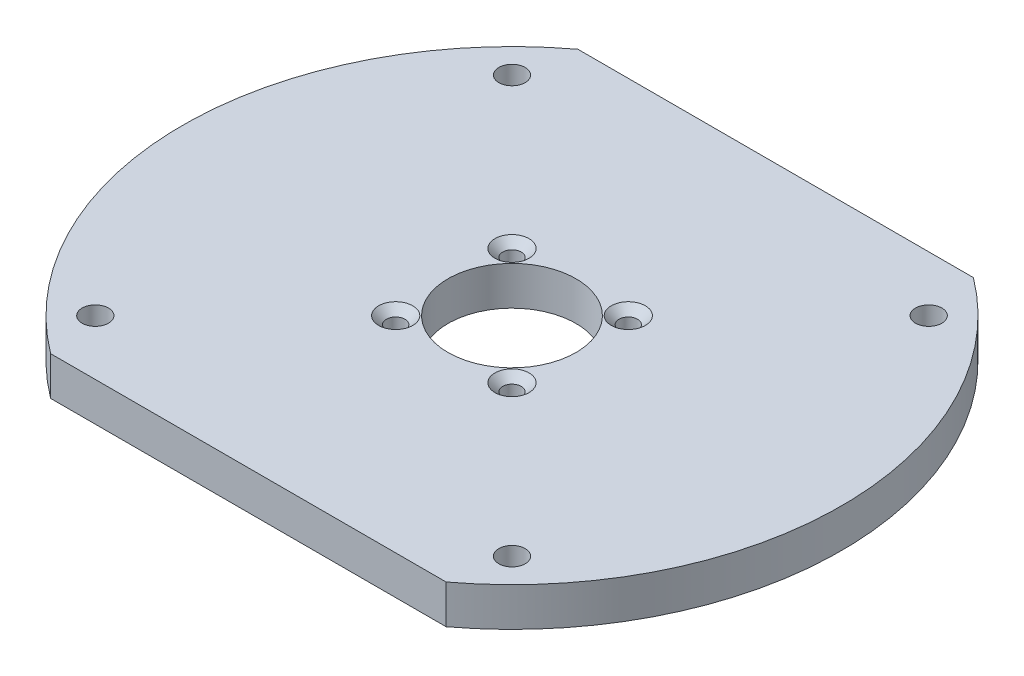
ISO-10303-21;
HEADER;
FILE_DESCRIPTION(('STEP AP214'),'2;1');
FILE_NAME('part.step','',(''),(''),'','','');
FILE_SCHEMA(('AUTOMOTIVE_DESIGN { 1 0 10303 214 1 1 1 1 }'));
ENDSEC;
DATA;
#1=APPLICATION_CONTEXT('core data for automotive mechanical design processes');
#2=APPLICATION_PROTOCOL_DEFINITION('international standard','automotive_design',2000,#1);
#3=PRODUCT_CONTEXT('',#1,'mechanical');
#4=PRODUCT('Part','Part','',(#3));
#5=PRODUCT_RELATED_PRODUCT_CATEGORY('part','',(#4));
#6=PRODUCT_DEFINITION_FORMATION('','',#4);
#7=PRODUCT_DEFINITION_CONTEXT('part definition',#1,'design');
#8=PRODUCT_DEFINITION('design','',#6,#7);
#9=PRODUCT_DEFINITION_SHAPE('','',#8);
#10=(LENGTH_UNIT() NAMED_UNIT(*) SI_UNIT(.MILLI.,.METRE.));
#11=(NAMED_UNIT(*) PLANE_ANGLE_UNIT() SI_UNIT($,.RADIAN.));
#12=(NAMED_UNIT(*) SI_UNIT($,.STERADIAN.) SOLID_ANGLE_UNIT());
#13=UNCERTAINTY_MEASURE_WITH_UNIT(LENGTH_MEASURE(1.E-05),#10,'distance_accuracy_value','');
#14=(GEOMETRIC_REPRESENTATION_CONTEXT(3) GLOBAL_UNCERTAINTY_ASSIGNED_CONTEXT((#13)) GLOBAL_UNIT_ASSIGNED_CONTEXT((#10,
#11,#12)) REPRESENTATION_CONTEXT('',''));
#15=CARTESIAN_POINT('',(0.,0.,0.));
#16=DIRECTION('',(0.,0.,1.));
#17=DIRECTION('',(1.,0.,0.));
#18=AXIS2_PLACEMENT_3D('',#15,#16,#17);
#19=CARTESIAN_POINT('',(0.,5.,0.));
#20=DIRECTION('',(0.,-1.,0.));
#21=DIRECTION('',(0.,0.,-1.));
#22=AXIS2_PLACEMENT_3D('',#19,#20,#21);
#23=CYLINDRICAL_SURFACE('',#22,42.5);
#24=CARTESIAN_POINT('',(0.,5.,0.));
#25=DIRECTION('',(0.,1.,0.));
#26=DIRECTION('',(0.,0.,1.));
#27=AXIS2_PLACEMENT_3D('',#24,#25,#26);
#28=CIRCLE('',#27,42.5);
#29=CARTESIAN_POINT('',(-25.5,5.,-34.));
#30=VERTEX_POINT('',#29);
#31=CARTESIAN_POINT('',(-25.5,5.,34.));
#32=VERTEX_POINT('',#31);
#33=EDGE_CURVE('E55',#30,#32,#28,.T.);
#34=ORIENTED_EDGE('',*,*,#33,.F.);
#35=DIRECTION('',(0.,-1.,0.));
#36=VECTOR('',#35,1.);
#37=CARTESIAN_POINT('',(-25.5,148.081325214019,-34.));
#38=LINE('',#37,#36);
#39=CARTESIAN_POINT('',(-25.5,0.,-34.));
#40=VERTEX_POINT('',#39);
#41=EDGE_CURVE('E72',#30,#40,#38,.T.);
#42=ORIENTED_EDGE('',*,*,#41,.T.);
#43=CARTESIAN_POINT('',(0.,0.,0.));
#44=DIRECTION('',(0.,1.,0.));
#45=DIRECTION('',(0.,0.,1.));
#46=AXIS2_PLACEMENT_3D('',#43,#44,#45);
#47=CIRCLE('',#46,42.5);
#48=CARTESIAN_POINT('',(-25.5,0.,34.));
#49=VERTEX_POINT('',#48);
#50=EDGE_CURVE('E91',#40,#49,#47,.T.);
#51=ORIENTED_EDGE('',*,*,#50,.T.);
#52=DIRECTION('',(0.,-1.,0.));
#53=VECTOR('',#52,1.);
#54=CARTESIAN_POINT('',(-25.5,155.39011769395,34.));
#55=LINE('',#54,#53);
#56=EDGE_CURVE('E86',#32,#49,#55,.T.);
#57=ORIENTED_EDGE('',*,*,#56,.F.);
#58=EDGE_LOOP('',(#34,#42,#51,#57));
#59=FACE_BOUND('',#58,.T.);
#60=ADVANCED_FACE('F33',(#59),#23,.T.);
#61=CARTESIAN_POINT('',(25.5,0.,34.));
#62=VERTEX_POINT('',#61);
#63=CARTESIAN_POINT('',(25.5,0.,-34.));
#64=VERTEX_POINT('',#63);
#65=EDGE_CURVE('E88',#62,#64,#47,.T.);
#66=ORIENTED_EDGE('',*,*,#65,.T.);
#67=DIRECTION('',(0.,-1.,0.));
#68=VECTOR('',#67,1.);
#69=CARTESIAN_POINT('',(25.5,148.081325214019,-34.));
#70=LINE('',#69,#68);
#71=CARTESIAN_POINT('',(25.5,5.,-34.));
#72=VERTEX_POINT('',#71);
#73=EDGE_CURVE('E48',#72,#64,#70,.T.);
#74=ORIENTED_EDGE('',*,*,#73,.F.);
#75=CARTESIAN_POINT('',(25.5,5.,34.));
#76=VERTEX_POINT('',#75);
#77=EDGE_CURVE('E82',#76,#72,#28,.T.);
#78=ORIENTED_EDGE('',*,*,#77,.F.);
#79=DIRECTION('',(0.,-1.,0.));
#80=VECTOR('',#79,1.);
#81=CARTESIAN_POINT('',(25.5,155.39011769395,34.));
#82=LINE('',#81,#80);
#83=EDGE_CURVE('E83',#76,#62,#82,.T.);
#84=ORIENTED_EDGE('',*,*,#83,.T.);
#85=EDGE_LOOP('',(#66,#74,#78,#84));
#86=FACE_BOUND('',#85,.T.);
#87=ADVANCED_FACE('F35',(#86),#23,.T.);
#88=CARTESIAN_POINT('',(0.,5.,0.));
#89=DIRECTION('',(0.,1.,0.));
#90=DIRECTION('',(0.,0.,1.));
#91=AXIS2_PLACEMENT_3D('',#88,#89,#90);
#92=PLANE('',#91);
#93=DIRECTION('',(1.,0.,0.));
#94=VECTOR('',#93,1.);
#95=CARTESIAN_POINT('',(0.,5.,-34.));
#96=LINE('',#95,#94);
#97=EDGE_CURVE('E74',#30,#72,#96,.T.);
#98=ORIENTED_EDGE('',*,*,#97,.F.);
#99=ORIENTED_EDGE('',*,*,#33,.T.);
#100=DIRECTION('',(1.,0.,0.));
#101=VECTOR('',#100,1.);
#102=CARTESIAN_POINT('',(0.,5.,34.));
#103=LINE('',#102,#101);
#104=EDGE_CURVE('E106',#32,#76,#103,.T.);
#105=ORIENTED_EDGE('',*,*,#104,.T.);
#106=ORIENTED_EDGE('',*,*,#77,.T.);
#107=EDGE_LOOP('',(#98,#99,#105,#106));
#108=FACE_BOUND('',#107,.T.);
#109=CARTESIAN_POINT('',(-26.870057685089,5.,-26.8700576850886));
#110=DIRECTION('',(0.,-1.,0.));
#111=DIRECTION('',(0.,0.,-1.));
#112=AXIS2_PLACEMENT_3D('',#109,#110,#111);
#113=CIRCLE('',#112,1.7);
#114=CARTESIAN_POINT('',(-26.870057685089,5.,-28.5700576850886));
#115=VERTEX_POINT('',#114);
#116=EDGE_CURVE('E116',#115,#115,#113,.T.);
#117=ORIENTED_EDGE('',*,*,#116,.T.);
#118=EDGE_LOOP('',(#117));
#119=FACE_BOUND('',#118,.T.);
#120=CARTESIAN_POINT('',(26.8700576850889,5.,-26.8700576850888));
#121=DIRECTION('',(0.,-1.,0.));
#122=DIRECTION('',(0.,0.,-1.));
#123=AXIS2_PLACEMENT_3D('',#120,#121,#122);
#124=CIRCLE('',#123,1.7);
#125=CARTESIAN_POINT('',(26.8700576850889,5.,-28.5700576850888));
#126=VERTEX_POINT('',#125);
#127=EDGE_CURVE('E125',#126,#126,#124,.T.);
#128=ORIENTED_EDGE('',*,*,#127,.T.);
#129=EDGE_LOOP('',(#128));
#130=FACE_BOUND('',#129,.T.);
#131=CARTESIAN_POINT('',(26.8700576850888,5.,26.8700576850888));
#132=DIRECTION('',(0.,-1.,0.));
#133=DIRECTION('',(0.,0.,-1.));
#134=AXIS2_PLACEMENT_3D('',#131,#132,#133);
#135=CIRCLE('',#134,1.7);
#136=CARTESIAN_POINT('',(26.8700576850888,5.,25.1700576850888));
#137=VERTEX_POINT('',#136);
#138=EDGE_CURVE('E134',#137,#137,#135,.T.);
#139=ORIENTED_EDGE('',*,*,#138,.T.);
#140=EDGE_LOOP('',(#139));
#141=FACE_BOUND('',#140,.T.);
#142=CARTESIAN_POINT('',(-26.8700576850889,5.,26.8700576850888));
#143=DIRECTION('',(0.,-1.,0.));
#144=DIRECTION('',(0.,0.,-1.));
#145=AXIS2_PLACEMENT_3D('',#142,#143,#144);
#146=CIRCLE('',#145,1.7);
#147=CARTESIAN_POINT('',(-26.8700576850889,5.,25.1700576850888));
#148=VERTEX_POINT('',#147);
#149=EDGE_CURVE('E143',#148,#148,#146,.T.);
#150=ORIENTED_EDGE('',*,*,#149,.T.);
#151=EDGE_LOOP('',(#150));
#152=FACE_BOUND('',#151,.T.);
#153=CARTESIAN_POINT('',(-7.5,5.,-7.5));
#154=DIRECTION('',(0.,1.,0.));
#155=DIRECTION('',(0.,0.,1.));
#156=AXIS2_PLACEMENT_3D('',#153,#154,#155);
#157=CIRCLE('',#156,2.2);
#158=CARTESIAN_POINT('',(-7.5,5.,-5.3));
#159=VERTEX_POINT('',#158);
#160=EDGE_CURVE('E146',#159,#159,#157,.T.);
#161=ORIENTED_EDGE('',*,*,#160,.F.);
#162=EDGE_LOOP('',(#161));
#163=FACE_BOUND('',#162,.T.);
#164=CARTESIAN_POINT('',(7.5,5.,-7.5));
#165=DIRECTION('',(0.,1.,0.));
#166=DIRECTION('',(0.,0.,1.));
#167=AXIS2_PLACEMENT_3D('',#164,#165,#166);
#168=CIRCLE('',#167,2.2);
#169=CARTESIAN_POINT('',(7.5,5.,-5.3));
#170=VERTEX_POINT('',#169);
#171=EDGE_CURVE('E155',#170,#170,#168,.T.);
#172=ORIENTED_EDGE('',*,*,#171,.F.);
#173=EDGE_LOOP('',(#172));
#174=FACE_BOUND('',#173,.T.);
#175=CARTESIAN_POINT('',(7.5,5.,7.5));
#176=DIRECTION('',(0.,1.,0.));
#177=DIRECTION('',(0.,0.,1.));
#178=AXIS2_PLACEMENT_3D('',#175,#176,#177);
#179=CIRCLE('',#178,2.2);
#180=CARTESIAN_POINT('',(7.5,5.,9.7));
#181=VERTEX_POINT('',#180);
#182=EDGE_CURVE('E164',#181,#181,#179,.T.);
#183=ORIENTED_EDGE('',*,*,#182,.F.);
#184=EDGE_LOOP('',(#183));
#185=FACE_BOUND('',#184,.T.);
#186=CARTESIAN_POINT('',(-7.5,5.,7.5));
#187=DIRECTION('',(0.,1.,0.));
#188=DIRECTION('',(0.,0.,1.));
#189=AXIS2_PLACEMENT_3D('',#186,#187,#188);
#190=CIRCLE('',#189,2.2);
#191=CARTESIAN_POINT('',(-7.5,5.,9.7));
#192=VERTEX_POINT('',#191);
#193=EDGE_CURVE('E173',#192,#192,#190,.T.);
#194=ORIENTED_EDGE('',*,*,#193,.F.);
#195=EDGE_LOOP('',(#194));
#196=FACE_BOUND('',#195,.T.);
#197=CARTESIAN_POINT('',(0.,5.,0.));
#198=DIRECTION('',(0.,1.,0.));
#199=DIRECTION('',(0.,0.,1.));
#200=AXIS2_PLACEMENT_3D('',#197,#198,#199);
#201=CIRCLE('',#200,8.25);
#202=CARTESIAN_POINT('',(0.,5.,8.25));
#203=VERTEX_POINT('',#202);
#204=EDGE_CURVE('E94',#203,#203,#201,.T.);
#205=ORIENTED_EDGE('',*,*,#204,.F.);
#206=EDGE_LOOP('',(#205));
#207=FACE_BOUND('',#206,.T.);
#208=ADVANCED_FACE('F79',(#108,#119,#130,#141,#152,#163,#174,#185,#196,#207),#92,.T.);
#209=CARTESIAN_POINT('',(0.,0.,0.));
#210=DIRECTION('',(0.,1.,0.));
#211=DIRECTION('',(0.,0.,1.));
#212=AXIS2_PLACEMENT_3D('',#209,#210,#211);
#213=PLANE('',#212);
#214=CARTESIAN_POINT('',(0.,0.,0.));
#215=DIRECTION('',(0.,1.,0.));
#216=DIRECTION('',(0.,0.,1.));
#217=AXIS2_PLACEMENT_3D('',#214,#215,#216);
#218=CIRCLE('',#217,8.25);
#219=CARTESIAN_POINT('',(0.,0.,8.25));
#220=VERTEX_POINT('',#219);
#221=EDGE_CURVE('E181',#220,#220,#218,.T.);
#222=ORIENTED_EDGE('',*,*,#221,.T.);
#223=EDGE_LOOP('',(#222));
#224=FACE_BOUND('',#223,.T.);
#225=CARTESIAN_POINT('',(-7.5,0.,7.5));
#226=DIRECTION('',(0.,1.,0.));
#227=DIRECTION('',(0.,0.,1.));
#228=AXIS2_PLACEMENT_3D('',#225,#226,#227);
#229=CIRCLE('',#228,1.2);
#230=CARTESIAN_POINT('',(-7.5,0.,8.7));
#231=VERTEX_POINT('',#230);
#232=EDGE_CURVE('E179',#231,#231,#229,.T.);
#233=ORIENTED_EDGE('',*,*,#232,.T.);
#234=EDGE_LOOP('',(#233));
#235=FACE_BOUND('',#234,.T.);
#236=CARTESIAN_POINT('',(7.5,0.,7.5));
#237=DIRECTION('',(0.,1.,0.));
#238=DIRECTION('',(0.,0.,1.));
#239=AXIS2_PLACEMENT_3D('',#236,#237,#238);
#240=CIRCLE('',#239,1.2);
#241=CARTESIAN_POINT('',(7.5,0.,8.7));
#242=VERTEX_POINT('',#241);
#243=EDGE_CURVE('E170',#242,#242,#240,.T.);
#244=ORIENTED_EDGE('',*,*,#243,.T.);
#245=EDGE_LOOP('',(#244));
#246=FACE_BOUND('',#245,.T.);
#247=CARTESIAN_POINT('',(7.5,0.,-7.5));
#248=DIRECTION('',(0.,1.,0.));
#249=DIRECTION('',(0.,0.,1.));
#250=AXIS2_PLACEMENT_3D('',#247,#248,#249);
#251=CIRCLE('',#250,1.2);
#252=CARTESIAN_POINT('',(7.5,0.,-6.3));
#253=VERTEX_POINT('',#252);
#254=EDGE_CURVE('E161',#253,#253,#251,.T.);
#255=ORIENTED_EDGE('',*,*,#254,.T.);
#256=EDGE_LOOP('',(#255));
#257=FACE_BOUND('',#256,.T.);
#258=CARTESIAN_POINT('',(-7.5,0.,-7.5));
#259=DIRECTION('',(0.,1.,0.));
#260=DIRECTION('',(0.,0.,1.));
#261=AXIS2_PLACEMENT_3D('',#258,#259,#260);
#262=CIRCLE('',#261,1.2);
#263=CARTESIAN_POINT('',(-7.5,0.,-6.3));
#264=VERTEX_POINT('',#263);
#265=EDGE_CURVE('E152',#264,#264,#262,.T.);
#266=ORIENTED_EDGE('',*,*,#265,.T.);
#267=EDGE_LOOP('',(#266));
#268=FACE_BOUND('',#267,.T.);
#269=CARTESIAN_POINT('',(-26.8700576850889,0.,26.8700576850888));
#270=DIRECTION('',(0.,-1.,0.));
#271=DIRECTION('',(0.,0.,-1.));
#272=AXIS2_PLACEMENT_3D('',#269,#270,#271);
#273=CIRCLE('',#272,3.15);
#274=CARTESIAN_POINT('',(-26.8700576850889,0.,23.7200576850888));
#275=VERTEX_POINT('',#274);
#276=EDGE_CURVE('E137',#275,#275,#273,.T.);
#277=ORIENTED_EDGE('',*,*,#276,.F.);
#278=EDGE_LOOP('',(#277));
#279=FACE_BOUND('',#278,.T.);
#280=CARTESIAN_POINT('',(26.8700576850888,0.,26.8700576850888));
#281=DIRECTION('',(0.,-1.,0.));
#282=DIRECTION('',(0.,0.,-1.));
#283=AXIS2_PLACEMENT_3D('',#280,#281,#282);
#284=CIRCLE('',#283,3.15);
#285=CARTESIAN_POINT('',(26.8700576850888,0.,23.7200576850888));
#286=VERTEX_POINT('',#285);
#287=EDGE_CURVE('E128',#286,#286,#284,.T.);
#288=ORIENTED_EDGE('',*,*,#287,.F.);
#289=EDGE_LOOP('',(#288));
#290=FACE_BOUND('',#289,.T.);
#291=CARTESIAN_POINT('',(26.8700576850889,0.,-26.8700576850888));
#292=DIRECTION('',(0.,-1.,0.));
#293=DIRECTION('',(0.,0.,-1.));
#294=AXIS2_PLACEMENT_3D('',#291,#292,#293);
#295=CIRCLE('',#294,3.15);
#296=CARTESIAN_POINT('',(26.8700576850889,0.,-30.0200576850888));
#297=VERTEX_POINT('',#296);
#298=EDGE_CURVE('E119',#297,#297,#295,.T.);
#299=ORIENTED_EDGE('',*,*,#298,.F.);
#300=EDGE_LOOP('',(#299));
#301=FACE_BOUND('',#300,.T.);
#302=CARTESIAN_POINT('',(-26.870057685089,0.,-26.8700576850886));
#303=DIRECTION('',(0.,-1.,0.));
#304=DIRECTION('',(0.,0.,-1.));
#305=AXIS2_PLACEMENT_3D('',#302,#303,#304);
#306=CIRCLE('',#305,3.15);
#307=CARTESIAN_POINT('',(-26.870057685089,0.,-30.0200576850886));
#308=VERTEX_POINT('',#307);
#309=EDGE_CURVE('E110',#308,#308,#306,.T.);
#310=ORIENTED_EDGE('',*,*,#309,.F.);
#311=EDGE_LOOP('',(#310));
#312=FACE_BOUND('',#311,.T.);
#313=ORIENTED_EDGE('',*,*,#50,.F.);
#314=DIRECTION('',(1.,0.,0.));
#315=VECTOR('',#314,1.);
#316=CARTESIAN_POINT('',(0.,0.,-34.));
#317=LINE('',#316,#315);
#318=EDGE_CURVE('E11',#40,#64,#317,.T.);
#319=ORIENTED_EDGE('',*,*,#318,.T.);
#320=ORIENTED_EDGE('',*,*,#65,.F.);
#321=DIRECTION('',(1.,0.,0.));
#322=VECTOR('',#321,1.);
#323=CARTESIAN_POINT('',(0.,0.,34.));
#324=LINE('',#323,#322);
#325=EDGE_CURVE('E41',#49,#62,#324,.T.);
#326=ORIENTED_EDGE('',*,*,#325,.F.);
#327=EDGE_LOOP('',(#313,#319,#320,#326));
#328=FACE_BOUND('',#327,.T.);
#329=ADVANCED_FACE('F103',(#224,#235,#246,#257,#268,#279,#290,#301,#312,#328),#213,.F.);
#330=CARTESIAN_POINT('',(0.,0.,0.));
#331=DIRECTION('',(0.,1.,0.));
#332=DIRECTION('',(0.,0.,1.));
#333=AXIS2_PLACEMENT_3D('',#330,#331,#332);
#334=CYLINDRICAL_SURFACE('',#333,8.25);
#335=ORIENTED_EDGE('',*,*,#221,.F.);
#336=EDGE_LOOP('',(#335));
#337=FACE_BOUND('',#336,.T.);
#338=ORIENTED_EDGE('',*,*,#204,.T.);
#339=EDGE_LOOP('',(#338));
#340=FACE_BOUND('',#339,.T.);
#341=ADVANCED_FACE('F188',(#337,#340),#334,.F.);
#342=CARTESIAN_POINT('',(-7.5,5.,7.5));
#343=DIRECTION('',(0.,1.,0.));
#344=DIRECTION('',(0.,0.,1.));
#345=AXIS2_PLACEMENT_3D('',#342,#343,#344);
#346=CYLINDRICAL_SURFACE('',#345,1.2);
#347=ORIENTED_EDGE('',*,*,#232,.F.);
#348=EDGE_LOOP('',(#347));
#349=FACE_BOUND('',#348,.T.);
#350=CARTESIAN_POINT('',(-7.5,4.,7.5));
#351=DIRECTION('',(0.,1.,0.));
#352=DIRECTION('',(0.,0.,1.));
#353=AXIS2_PLACEMENT_3D('',#350,#351,#352);
#354=CIRCLE('',#353,1.2);
#355=CARTESIAN_POINT('',(-7.5,4.,8.7));
#356=VERTEX_POINT('',#355);
#357=EDGE_CURVE('E176',#356,#356,#354,.T.);
#358=ORIENTED_EDGE('',*,*,#357,.T.);
#359=EDGE_LOOP('',(#358));
#360=FACE_BOUND('',#359,.T.);
#361=ADVANCED_FACE('F367',(#349,#360),#346,.F.);
#362=CARTESIAN_POINT('',(-7.5,5.,7.5));
#363=DIRECTION('',(0.,1.,0.));
#364=DIRECTION('',(0.,0.,1.));
#365=AXIS2_PLACEMENT_3D('',#362,#363,#364);
#366=CONICAL_SURFACE('',#365,2.2,0.785398163397449);
#367=ORIENTED_EDGE('',*,*,#357,.F.);
#368=EDGE_LOOP('',(#367));
#369=FACE_BOUND('',#368,.T.);
#370=ORIENTED_EDGE('',*,*,#193,.T.);
#371=EDGE_LOOP('',(#370));
#372=FACE_BOUND('',#371,.T.);
#373=ADVANCED_FACE('F358',(#369,#372),#366,.F.);
#374=CARTESIAN_POINT('',(7.5,5.,7.5));
#375=DIRECTION('',(0.,1.,0.));
#376=DIRECTION('',(0.,0.,1.));
#377=AXIS2_PLACEMENT_3D('',#374,#375,#376);
#378=CYLINDRICAL_SURFACE('',#377,1.2);
#379=ORIENTED_EDGE('',*,*,#243,.F.);
#380=EDGE_LOOP('',(#379));
#381=FACE_BOUND('',#380,.T.);
#382=CARTESIAN_POINT('',(7.5,4.,7.5));
#383=DIRECTION('',(0.,1.,0.));
#384=DIRECTION('',(0.,0.,1.));
#385=AXIS2_PLACEMENT_3D('',#382,#383,#384);
#386=CIRCLE('',#385,1.2);
#387=CARTESIAN_POINT('',(7.5,4.,8.7));
#388=VERTEX_POINT('',#387);
#389=EDGE_CURVE('E167',#388,#388,#386,.T.);
#390=ORIENTED_EDGE('',*,*,#389,.T.);
#391=EDGE_LOOP('',(#390));
#392=FACE_BOUND('',#391,.T.);
#393=ADVANCED_FACE('F349',(#381,#392),#378,.F.);
#394=CARTESIAN_POINT('',(7.5,5.,7.5));
#395=DIRECTION('',(0.,1.,0.));
#396=DIRECTION('',(0.,0.,1.));
#397=AXIS2_PLACEMENT_3D('',#394,#395,#396);
#398=CONICAL_SURFACE('',#397,2.2,0.785398163397449);
#399=ORIENTED_EDGE('',*,*,#389,.F.);
#400=EDGE_LOOP('',(#399));
#401=FACE_BOUND('',#400,.T.);
#402=ORIENTED_EDGE('',*,*,#182,.T.);
#403=EDGE_LOOP('',(#402));
#404=FACE_BOUND('',#403,.T.);
#405=ADVANCED_FACE('F340',(#401,#404),#398,.F.);
#406=CARTESIAN_POINT('',(7.5,5.,-7.5));
#407=DIRECTION('',(0.,1.,0.));
#408=DIRECTION('',(0.,0.,1.));
#409=AXIS2_PLACEMENT_3D('',#406,#407,#408);
#410=CYLINDRICAL_SURFACE('',#409,1.2);
#411=ORIENTED_EDGE('',*,*,#254,.F.);
#412=EDGE_LOOP('',(#411));
#413=FACE_BOUND('',#412,.T.);
#414=CARTESIAN_POINT('',(7.5,4.,-7.5));
#415=DIRECTION('',(0.,1.,0.));
#416=DIRECTION('',(0.,0.,1.));
#417=AXIS2_PLACEMENT_3D('',#414,#415,#416);
#418=CIRCLE('',#417,1.2);
#419=CARTESIAN_POINT('',(7.5,4.,-6.3));
#420=VERTEX_POINT('',#419);
#421=EDGE_CURVE('E158',#420,#420,#418,.T.);
#422=ORIENTED_EDGE('',*,*,#421,.T.);
#423=EDGE_LOOP('',(#422));
#424=FACE_BOUND('',#423,.T.);
#425=ADVANCED_FACE('F331',(#413,#424),#410,.F.);
#426=CARTESIAN_POINT('',(7.5,5.,-7.5));
#427=DIRECTION('',(0.,1.,0.));
#428=DIRECTION('',(0.,0.,1.));
#429=AXIS2_PLACEMENT_3D('',#426,#427,#428);
#430=CONICAL_SURFACE('',#429,2.2,0.785398163397449);
#431=ORIENTED_EDGE('',*,*,#421,.F.);
#432=EDGE_LOOP('',(#431));
#433=FACE_BOUND('',#432,.T.);
#434=ORIENTED_EDGE('',*,*,#171,.T.);
#435=EDGE_LOOP('',(#434));
#436=FACE_BOUND('',#435,.T.);
#437=ADVANCED_FACE('F322',(#433,#436),#430,.F.);
#438=CARTESIAN_POINT('',(-7.5,5.,-7.5));
#439=DIRECTION('',(0.,1.,0.));
#440=DIRECTION('',(0.,0.,1.));
#441=AXIS2_PLACEMENT_3D('',#438,#439,#440);
#442=CYLINDRICAL_SURFACE('',#441,1.2);
#443=ORIENTED_EDGE('',*,*,#265,.F.);
#444=EDGE_LOOP('',(#443));
#445=FACE_BOUND('',#444,.T.);
#446=CARTESIAN_POINT('',(-7.5,4.,-7.5));
#447=DIRECTION('',(0.,1.,0.));
#448=DIRECTION('',(0.,0.,1.));
#449=AXIS2_PLACEMENT_3D('',#446,#447,#448);
#450=CIRCLE('',#449,1.2);
#451=CARTESIAN_POINT('',(-7.5,4.,-6.3));
#452=VERTEX_POINT('',#451);
#453=EDGE_CURVE('E149',#452,#452,#450,.T.);
#454=ORIENTED_EDGE('',*,*,#453,.T.);
#455=EDGE_LOOP('',(#454));
#456=FACE_BOUND('',#455,.T.);
#457=ADVANCED_FACE('F313',(#445,#456),#442,.F.);
#458=CARTESIAN_POINT('',(-7.5,5.,-7.5));
#459=DIRECTION('',(0.,1.,0.));
#460=DIRECTION('',(0.,0.,1.));
#461=AXIS2_PLACEMENT_3D('',#458,#459,#460);
#462=CONICAL_SURFACE('',#461,2.2,0.785398163397449);
#463=ORIENTED_EDGE('',*,*,#453,.F.);
#464=EDGE_LOOP('',(#463));
#465=FACE_BOUND('',#464,.T.);
#466=ORIENTED_EDGE('',*,*,#160,.T.);
#467=EDGE_LOOP('',(#466));
#468=FACE_BOUND('',#467,.T.);
#469=ADVANCED_FACE('F304',(#465,#468),#462,.F.);
#470=CARTESIAN_POINT('',(-26.8700576850889,0.,26.8700576850888));
#471=DIRECTION('',(0.,-1.,0.));
#472=DIRECTION('',(0.,0.,-1.));
#473=AXIS2_PLACEMENT_3D('',#470,#471,#472);
#474=CYLINDRICAL_SURFACE('',#473,1.7);
#475=ORIENTED_EDGE('',*,*,#149,.F.);
#476=EDGE_LOOP('',(#475));
#477=FACE_BOUND('',#476,.T.);
#478=CARTESIAN_POINT('',(-26.8700576850889,1.45,26.8700576850888));
#479=DIRECTION('',(0.,-1.,0.));
#480=DIRECTION('',(0.,0.,-1.));
#481=AXIS2_PLACEMENT_3D('',#478,#479,#480);
#482=CIRCLE('',#481,1.7);
#483=CARTESIAN_POINT('',(-26.8700576850889,1.45,25.1700576850888));
#484=VERTEX_POINT('',#483);
#485=EDGE_CURVE('E140',#484,#484,#482,.T.);
#486=ORIENTED_EDGE('',*,*,#485,.T.);
#487=EDGE_LOOP('',(#486));
#488=FACE_BOUND('',#487,.T.);
#489=ADVANCED_FACE('F295',(#477,#488),#474,.F.);
#490=CARTESIAN_POINT('',(-26.8700576850889,0.,26.8700576850888));
#491=DIRECTION('',(0.,-1.,0.));
#492=DIRECTION('',(0.,0.,-1.));
#493=AXIS2_PLACEMENT_3D('',#490,#491,#492);
#494=CONICAL_SURFACE('',#493,3.15,0.785398163397448);
#495=ORIENTED_EDGE('',*,*,#485,.F.);
#496=EDGE_LOOP('',(#495));
#497=FACE_BOUND('',#496,.T.);
#498=ORIENTED_EDGE('',*,*,#276,.T.);
#499=EDGE_LOOP('',(#498));
#500=FACE_BOUND('',#499,.T.);
#501=ADVANCED_FACE('F286',(#497,#500),#494,.F.);
#502=CARTESIAN_POINT('',(26.8700576850888,0.,26.8700576850888));
#503=DIRECTION('',(0.,-1.,0.));
#504=DIRECTION('',(0.,0.,-1.));
#505=AXIS2_PLACEMENT_3D('',#502,#503,#504);
#506=CYLINDRICAL_SURFACE('',#505,1.7);
#507=ORIENTED_EDGE('',*,*,#138,.F.);
#508=EDGE_LOOP('',(#507));
#509=FACE_BOUND('',#508,.T.);
#510=CARTESIAN_POINT('',(26.8700576850888,1.45,26.8700576850888));
#511=DIRECTION('',(0.,-1.,0.));
#512=DIRECTION('',(0.,0.,-1.));
#513=AXIS2_PLACEMENT_3D('',#510,#511,#512);
#514=CIRCLE('',#513,1.7);
#515=CARTESIAN_POINT('',(26.8700576850888,1.45,25.1700576850888));
#516=VERTEX_POINT('',#515);
#517=EDGE_CURVE('E131',#516,#516,#514,.T.);
#518=ORIENTED_EDGE('',*,*,#517,.T.);
#519=EDGE_LOOP('',(#518));
#520=FACE_BOUND('',#519,.T.);
#521=ADVANCED_FACE('F277',(#509,#520),#506,.F.);
#522=CARTESIAN_POINT('',(26.8700576850888,0.,26.8700576850888));
#523=DIRECTION('',(0.,-1.,0.));
#524=DIRECTION('',(0.,0.,-1.));
#525=AXIS2_PLACEMENT_3D('',#522,#523,#524);
#526=CONICAL_SURFACE('',#525,3.15,0.785398163397448);
#527=ORIENTED_EDGE('',*,*,#517,.F.);
#528=EDGE_LOOP('',(#527));
#529=FACE_BOUND('',#528,.T.);
#530=ORIENTED_EDGE('',*,*,#287,.T.);
#531=EDGE_LOOP('',(#530));
#532=FACE_BOUND('',#531,.T.);
#533=ADVANCED_FACE('F268',(#529,#532),#526,.F.);
#534=CARTESIAN_POINT('',(26.8700576850889,0.,-26.8700576850888));
#535=DIRECTION('',(0.,-1.,0.));
#536=DIRECTION('',(0.,0.,-1.));
#537=AXIS2_PLACEMENT_3D('',#534,#535,#536);
#538=CYLINDRICAL_SURFACE('',#537,1.7);
#539=ORIENTED_EDGE('',*,*,#127,.F.);
#540=EDGE_LOOP('',(#539));
#541=FACE_BOUND('',#540,.T.);
#542=CARTESIAN_POINT('',(26.8700576850889,1.45,-26.8700576850888));
#543=DIRECTION('',(0.,-1.,0.));
#544=DIRECTION('',(0.,0.,-1.));
#545=AXIS2_PLACEMENT_3D('',#542,#543,#544);
#546=CIRCLE('',#545,1.7);
#547=CARTESIAN_POINT('',(26.8700576850889,1.45,-28.5700576850888));
#548=VERTEX_POINT('',#547);
#549=EDGE_CURVE('E122',#548,#548,#546,.T.);
#550=ORIENTED_EDGE('',*,*,#549,.T.);
#551=EDGE_LOOP('',(#550));
#552=FACE_BOUND('',#551,.T.);
#553=ADVANCED_FACE('F259',(#541,#552),#538,.F.);
#554=CARTESIAN_POINT('',(26.8700576850889,0.,-26.8700576850888));
#555=DIRECTION('',(0.,-1.,0.));
#556=DIRECTION('',(0.,0.,-1.));
#557=AXIS2_PLACEMENT_3D('',#554,#555,#556);
#558=CONICAL_SURFACE('',#557,3.15,0.785398163397448);
#559=ORIENTED_EDGE('',*,*,#549,.F.);
#560=EDGE_LOOP('',(#559));
#561=FACE_BOUND('',#560,.T.);
#562=ORIENTED_EDGE('',*,*,#298,.T.);
#563=EDGE_LOOP('',(#562));
#564=FACE_BOUND('',#563,.T.);
#565=ADVANCED_FACE('F250',(#561,#564),#558,.F.);
#566=CARTESIAN_POINT('',(-26.870057685089,0.,-26.8700576850886));
#567=DIRECTION('',(0.,-1.,0.));
#568=DIRECTION('',(0.,0.,-1.));
#569=AXIS2_PLACEMENT_3D('',#566,#567,#568);
#570=CYLINDRICAL_SURFACE('',#569,1.7);
#571=ORIENTED_EDGE('',*,*,#116,.F.);
#572=EDGE_LOOP('',(#571));
#573=FACE_BOUND('',#572,.T.);
#574=CARTESIAN_POINT('',(-26.870057685089,1.45,-26.8700576850886));
#575=DIRECTION('',(0.,-1.,0.));
#576=DIRECTION('',(0.,0.,-1.));
#577=AXIS2_PLACEMENT_3D('',#574,#575,#576);
#578=CIRCLE('',#577,1.7);
#579=CARTESIAN_POINT('',(-26.870057685089,1.45,-28.5700576850886));
#580=VERTEX_POINT('',#579);
#581=EDGE_CURVE('E113',#580,#580,#578,.T.);
#582=ORIENTED_EDGE('',*,*,#581,.T.);
#583=EDGE_LOOP('',(#582));
#584=FACE_BOUND('',#583,.T.);
#585=ADVANCED_FACE('F241',(#573,#584),#570,.F.);
#586=CARTESIAN_POINT('',(-26.870057685089,0.,-26.8700576850886));
#587=DIRECTION('',(0.,-1.,0.));
#588=DIRECTION('',(0.,0.,-1.));
#589=AXIS2_PLACEMENT_3D('',#586,#587,#588);
#590=CONICAL_SURFACE('',#589,3.15,0.785398163397448);
#591=ORIENTED_EDGE('',*,*,#581,.F.);
#592=EDGE_LOOP('',(#591));
#593=FACE_BOUND('',#592,.T.);
#594=ORIENTED_EDGE('',*,*,#309,.T.);
#595=EDGE_LOOP('',(#594));
#596=FACE_BOUND('',#595,.T.);
#597=ADVANCED_FACE('F219',(#593,#596),#590,.F.);
#598=CARTESIAN_POINT('',(25.5,155.39011769395,34.));
#599=DIRECTION('',(0.,0.,1.));
#600=DIRECTION('',(1.,0.,0.));
#601=AXIS2_PLACEMENT_3D('',#598,#599,#600);
#602=PLANE('',#601);
#603=ORIENTED_EDGE('',*,*,#104,.F.);
#604=ORIENTED_EDGE('',*,*,#56,.T.);
#605=ORIENTED_EDGE('',*,*,#325,.T.);
#606=ORIENTED_EDGE('',*,*,#83,.F.);
#607=EDGE_LOOP('',(#603,#604,#605,#606));
#608=FACE_BOUND('',#607,.T.);
#609=ADVANCED_FACE('F100',(#608),#602,.T.);
#610=CARTESIAN_POINT('',(25.5,148.081325214019,-34.));
#611=DIRECTION('',(0.,0.,1.));
#612=DIRECTION('',(1.,0.,0.));
#613=AXIS2_PLACEMENT_3D('',#610,#611,#612);
#614=PLANE('',#613);
#615=ORIENTED_EDGE('',*,*,#41,.F.);
#616=ORIENTED_EDGE('',*,*,#97,.T.);
#617=ORIENTED_EDGE('',*,*,#73,.T.);
#618=ORIENTED_EDGE('',*,*,#318,.F.);
#619=EDGE_LOOP('',(#615,#616,#617,#618));
#620=FACE_BOUND('',#619,.T.);
#621=ADVANCED_FACE('F73',(#620),#614,.F.);
#622=CLOSED_SHELL('',(#60,#87,#208,#329,#341,#361,#373,#393,#405,#425,#437,#457,#469,#489,#501,
#521,#533,#553,#565,#585,#597,#609,#621));
#623=MANIFOLD_SOLID_BREP('B2',#622);
#624=ADVANCED_BREP_SHAPE_REPRESENTATION('',(#18,#623),#14);
#625=SHAPE_DEFINITION_REPRESENTATION(#9,#624);
ENDSEC;
END-ISO-10303-21;
